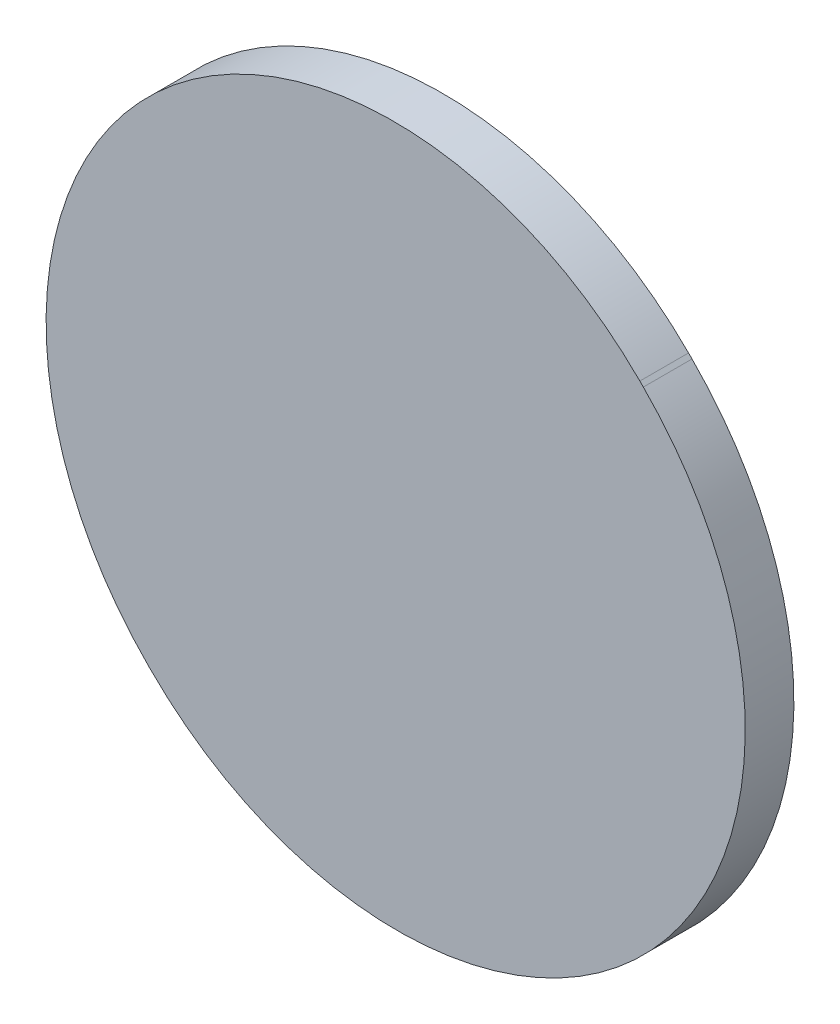
ISO-10303-21;
HEADER;
FILE_DESCRIPTION(('STEP AP214'),'2;1');
FILE_NAME('part.step','',(''),(''),'','','');
FILE_SCHEMA(('AUTOMOTIVE_DESIGN { 1 0 10303 214 1 1 1 1 }'));
ENDSEC;
DATA;
#1=APPLICATION_CONTEXT('core data for automotive mechanical design processes');
#2=APPLICATION_PROTOCOL_DEFINITION('international standard','automotive_design',2000,#1);
#3=PRODUCT_CONTEXT('',#1,'mechanical');
#4=PRODUCT('Part','Part','',(#3));
#5=PRODUCT_RELATED_PRODUCT_CATEGORY('part','',(#4));
#6=PRODUCT_DEFINITION_FORMATION('','',#4);
#7=PRODUCT_DEFINITION_CONTEXT('part definition',#1,'design');
#8=PRODUCT_DEFINITION('design','',#6,#7);
#9=PRODUCT_DEFINITION_SHAPE('','',#8);
#10=(LENGTH_UNIT() NAMED_UNIT(*) SI_UNIT(.MILLI.,.METRE.));
#11=(NAMED_UNIT(*) PLANE_ANGLE_UNIT() SI_UNIT($,.RADIAN.));
#12=(NAMED_UNIT(*) SI_UNIT($,.STERADIAN.) SOLID_ANGLE_UNIT());
#13=UNCERTAINTY_MEASURE_WITH_UNIT(LENGTH_MEASURE(1.E-05),#10,'distance_accuracy_value','');
#14=(GEOMETRIC_REPRESENTATION_CONTEXT(3) GLOBAL_UNCERTAINTY_ASSIGNED_CONTEXT((#13)) GLOBAL_UNIT_ASSIGNED_CONTEXT((#10,
#11,#12)) REPRESENTATION_CONTEXT('',''));
#15=CARTESIAN_POINT('',(0.,0.,0.));
#16=DIRECTION('',(0.,0.,1.));
#17=DIRECTION('',(1.,0.,0.));
#18=AXIS2_PLACEMENT_3D('',#15,#16,#17);
#19=CARTESIAN_POINT('',(155.329276,-116.363223,1.635));
#20=DIRECTION('',(0.,0.,1.));
#21=DIRECTION('',(1.,0.,0.));
#22=AXIS2_PLACEMENT_3D('',#19,#20,#21);
#23=PLANE('',#22);
#24=DIRECTION('',(-0.707106781184548,0.707106781188548,0.));
#25=VECTOR('',#24,1.);
#26=CARTESIAN_POINT('',(155.329276,-116.363223,1.635));
#27=LINE('',#26,#25);
#28=CARTESIAN_POINT('',(155.329276,-116.363223,1.635));
#29=VERTEX_POINT('',#28);
#30=CARTESIAN_POINT('',(155.326776,-116.360723,1.635));
#31=VERTEX_POINT('',#30);
#32=EDGE_CURVE('E82',#29,#31,#27,.T.);
#33=ORIENTED_EDGE('',*,*,#32,.T.);
#34=CARTESIAN_POINT('',(155.1499995,-116.5374995,1.635));
#35=DIRECTION('',(0.,0.,1.));
#36=DIRECTION('',(0.707106781186548,0.707106781186548,0.));
#37=AXIS2_PLACEMENT_3D('',#34,#35,#36);
#38=CIRCLE('',#37,0.249999723809);
#39=CARTESIAN_POINT('',(154.973223,-116.714276,1.635));
#40=VERTEX_POINT('',#39);
#41=EDGE_CURVE('E109',#31,#40,#38,.T.);
#42=ORIENTED_EDGE('',*,*,#41,.T.);
#43=DIRECTION('',(0.707106781186548,-0.707106781186548,0.));
#44=VECTOR('',#43,1.);
#45=CARTESIAN_POINT('',(154.973223,-116.714276,1.635));
#46=LINE('',#45,#44);
#47=CARTESIAN_POINT('',(154.975723,-116.716776,1.635));
#48=VERTEX_POINT('',#47);
#49=EDGE_CURVE('E75',#40,#48,#46,.T.);
#50=ORIENTED_EDGE('',*,*,#49,.T.);
#51=CARTESIAN_POINT('',(155.1524995,-116.5399995,1.635));
#52=DIRECTION('',(0.,0.,1.));
#53=DIRECTION('',(-0.707106781186548,-0.707106781186548,0.));
#54=AXIS2_PLACEMENT_3D('',#51,#52,#53);
#55=CIRCLE('',#54,0.249999723809);
#56=EDGE_CURVE('E11',#48,#29,#55,.T.);
#57=ORIENTED_EDGE('',*,*,#56,.T.);
#58=EDGE_LOOP('',(#33,#42,#50,#57));
#59=FACE_BOUND('',#58,.T.);
#60=ADVANCED_FACE('F17',(#59),#23,.T.);
#61=CARTESIAN_POINT('',(155.329276,-116.363223,1.6));
#62=DIRECTION('',(0.,0.,1.));
#63=DIRECTION('',(1.,0.,0.));
#64=AXIS2_PLACEMENT_3D('',#61,#62,#63);
#65=PLANE('',#64);
#66=CARTESIAN_POINT('',(155.1524995,-116.5399995,1.6));
#67=DIRECTION('',(0.,0.,1.));
#68=DIRECTION('',(-0.707106781186548,-0.707106781186548,0.));
#69=AXIS2_PLACEMENT_3D('',#66,#67,#68);
#70=CIRCLE('',#69,0.249999723809);
#71=CARTESIAN_POINT('',(154.975723,-116.716776,1.6));
#72=VERTEX_POINT('',#71);
#73=CARTESIAN_POINT('',(155.329276,-116.363223,1.6));
#74=VERTEX_POINT('',#73);
#75=EDGE_CURVE('E20',#72,#74,#70,.T.);
#76=ORIENTED_EDGE('',*,*,#75,.F.);
#77=DIRECTION('',(0.707106781186548,-0.707106781186548,0.));
#78=VECTOR('',#77,1.);
#79=CARTESIAN_POINT('',(154.973223,-116.714276,1.6));
#80=LINE('',#79,#78);
#81=CARTESIAN_POINT('',(154.973223,-116.714276,1.6));
#82=VERTEX_POINT('',#81);
#83=EDGE_CURVE('E100',#82,#72,#80,.T.);
#84=ORIENTED_EDGE('',*,*,#83,.F.);
#85=CARTESIAN_POINT('',(155.1499995,-116.5374995,1.6));
#86=DIRECTION('',(0.,0.,1.));
#87=DIRECTION('',(0.707106781186548,0.707106781186548,0.));
#88=AXIS2_PLACEMENT_3D('',#85,#86,#87);
#89=CIRCLE('',#88,0.249999723809);
#90=CARTESIAN_POINT('',(155.326776,-116.360723,1.6));
#91=VERTEX_POINT('',#90);
#92=EDGE_CURVE('E84',#91,#82,#89,.T.);
#93=ORIENTED_EDGE('',*,*,#92,.F.);
#94=DIRECTION('',(-0.707106781184548,0.707106781188548,0.));
#95=VECTOR('',#94,1.);
#96=CARTESIAN_POINT('',(155.329276,-116.363223,1.6));
#97=LINE('',#96,#95);
#98=EDGE_CURVE('E80',#74,#91,#97,.T.);
#99=ORIENTED_EDGE('',*,*,#98,.F.);
#100=EDGE_LOOP('',(#76,#84,#93,#99));
#101=FACE_BOUND('',#100,.T.);
#102=ADVANCED_FACE('F86',(#101),#65,.F.);
#103=CARTESIAN_POINT('',(155.1524995,-116.5399995,1.6));
#104=DIRECTION('',(0.,0.,-1.));
#105=DIRECTION('',(-0.707106781186548,-0.707106781186548,0.));
#106=AXIS2_PLACEMENT_3D('',#103,#104,#105);
#107=CYLINDRICAL_SURFACE('',#106,0.249999723809);
#108=ORIENTED_EDGE('',*,*,#75,.T.);
#109=DIRECTION('',(0.,0.,1.));
#110=VECTOR('',#109,1.);
#111=CARTESIAN_POINT('',(155.329276,-116.363223,1.6));
#112=LINE('',#111,#110);
#113=EDGE_CURVE('E69',#74,#29,#112,.T.);
#114=ORIENTED_EDGE('',*,*,#113,.T.);
#115=ORIENTED_EDGE('',*,*,#56,.F.);
#116=DIRECTION('',(0.,0.,1.));
#117=VECTOR('',#116,1.);
#118=CARTESIAN_POINT('',(154.975723,-116.716776,1.6));
#119=LINE('',#118,#117);
#120=EDGE_CURVE('E72',#72,#48,#119,.T.);
#121=ORIENTED_EDGE('',*,*,#120,.F.);
#122=EDGE_LOOP('',(#108,#114,#115,#121));
#123=FACE_BOUND('',#122,.T.);
#124=ADVANCED_FACE('F68',(#123),#107,.T.);
#125=CARTESIAN_POINT('',(154.973223,-116.714276,1.6));
#126=DIRECTION('',(0.707106781186548,0.707106781186548,0.));
#127=DIRECTION('',(0.,0.,-1.));
#128=AXIS2_PLACEMENT_3D('',#125,#126,#127);
#129=PLANE('',#128);
#130=ORIENTED_EDGE('',*,*,#83,.T.);
#131=ORIENTED_EDGE('',*,*,#120,.T.);
#132=ORIENTED_EDGE('',*,*,#49,.F.);
#133=DIRECTION('',(0.,0.,1.));
#134=VECTOR('',#133,1.);
#135=CARTESIAN_POINT('',(154.973223,-116.714276,1.6));
#136=LINE('',#135,#134);
#137=EDGE_CURVE('E105',#82,#40,#136,.T.);
#138=ORIENTED_EDGE('',*,*,#137,.F.);
#139=EDGE_LOOP('',(#130,#131,#132,#138));
#140=FACE_BOUND('',#139,.T.);
#141=ADVANCED_FACE('F120',(#140),#129,.F.);
#142=CARTESIAN_POINT('',(155.1499995,-116.5374995,1.6));
#143=DIRECTION('',(0.,0.,-1.));
#144=DIRECTION('',(0.707106781186548,0.707106781186548,0.));
#145=AXIS2_PLACEMENT_3D('',#142,#143,#144);
#146=CYLINDRICAL_SURFACE('',#145,0.249999723809);
#147=ORIENTED_EDGE('',*,*,#92,.T.);
#148=ORIENTED_EDGE('',*,*,#137,.T.);
#149=ORIENTED_EDGE('',*,*,#41,.F.);
#150=DIRECTION('',(0.,0.,1.));
#151=VECTOR('',#150,1.);
#152=CARTESIAN_POINT('',(155.326776,-116.360723,1.6));
#153=LINE('',#152,#151);
#154=EDGE_CURVE('E90',#91,#31,#153,.T.);
#155=ORIENTED_EDGE('',*,*,#154,.F.);
#156=EDGE_LOOP('',(#147,#148,#149,#155));
#157=FACE_BOUND('',#156,.T.);
#158=ADVANCED_FACE('F122',(#157),#146,.T.);
#159=CARTESIAN_POINT('',(155.329276,-116.363223,1.6));
#160=DIRECTION('',(-0.707106781188548,-0.707106781184548,0.));
#161=DIRECTION('',(-0.707106781184548,0.707106781188548,0.));
#162=AXIS2_PLACEMENT_3D('',#159,#160,#161);
#163=PLANE('',#162);
#164=ORIENTED_EDGE('',*,*,#98,.T.);
#165=ORIENTED_EDGE('',*,*,#154,.T.);
#166=ORIENTED_EDGE('',*,*,#32,.F.);
#167=ORIENTED_EDGE('',*,*,#113,.F.);
#168=EDGE_LOOP('',(#164,#165,#166,#167));
#169=FACE_BOUND('',#168,.T.);
#170=ADVANCED_FACE('F78',(#169),#163,.F.);
#171=CLOSED_SHELL('',(#60,#102,#124,#141,#158,#170));
#172=MANIFOLD_SOLID_BREP('B1',#171);
#173=ADVANCED_BREP_SHAPE_REPRESENTATION('',(#18,#172),#14);
#174=SHAPE_DEFINITION_REPRESENTATION(#9,#173);
ENDSEC;
END-ISO-10303-21;
